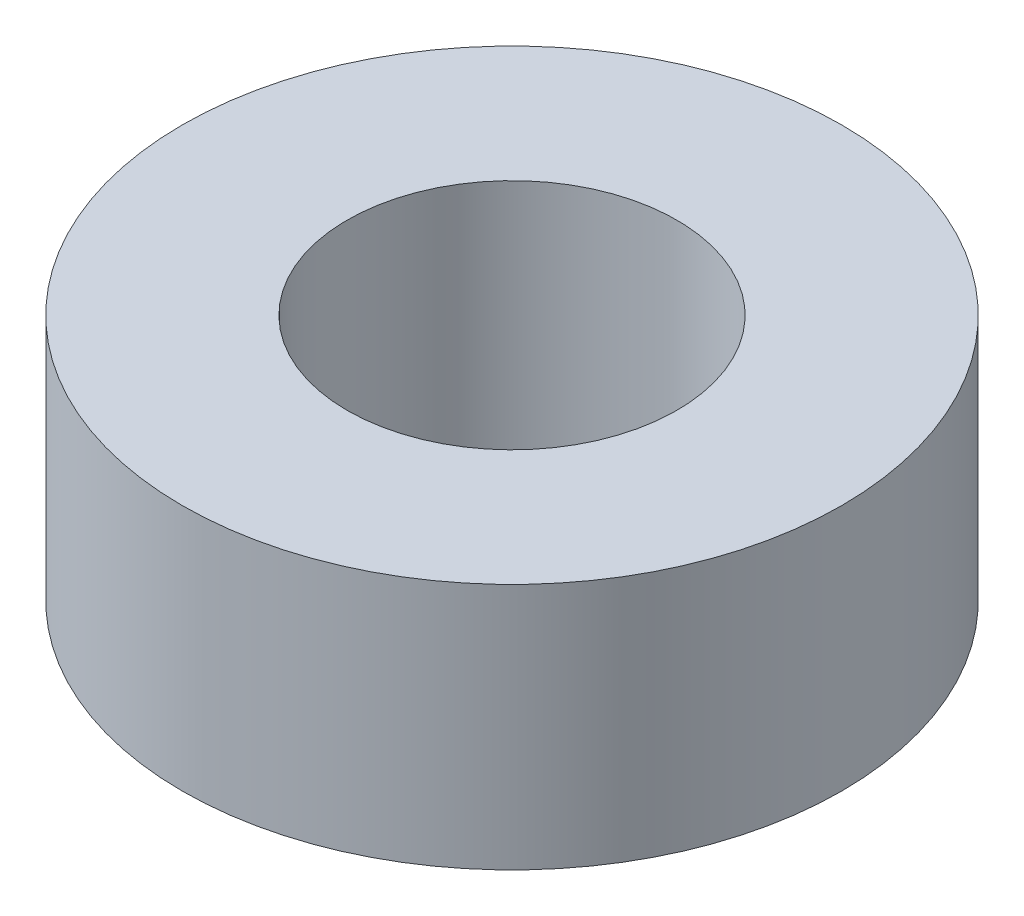
ISO-10303-21;
HEADER;
FILE_DESCRIPTION(('STEP AP214'),'2;1');
FILE_NAME('part.step','',(''),(''),'','','');
FILE_SCHEMA(('AUTOMOTIVE_DESIGN { 1 0 10303 214 1 1 1 1 }'));
ENDSEC;
DATA;
#1=APPLICATION_CONTEXT('core data for automotive mechanical design processes');
#2=APPLICATION_PROTOCOL_DEFINITION('international standard','automotive_design',2000,#1);
#3=PRODUCT_CONTEXT('',#1,'mechanical');
#4=PRODUCT('Part','Part','',(#3));
#5=PRODUCT_RELATED_PRODUCT_CATEGORY('part','',(#4));
#6=PRODUCT_DEFINITION_FORMATION('','',#4);
#7=PRODUCT_DEFINITION_CONTEXT('part definition',#1,'design');
#8=PRODUCT_DEFINITION('design','',#6,#7);
#9=PRODUCT_DEFINITION_SHAPE('','',#8);
#10=(LENGTH_UNIT() NAMED_UNIT(*) SI_UNIT(.MILLI.,.METRE.));
#11=(NAMED_UNIT(*) PLANE_ANGLE_UNIT() SI_UNIT($,.RADIAN.));
#12=(NAMED_UNIT(*) SI_UNIT($,.STERADIAN.) SOLID_ANGLE_UNIT());
#13=UNCERTAINTY_MEASURE_WITH_UNIT(LENGTH_MEASURE(1.E-05),#10,'distance_accuracy_value','');
#14=(GEOMETRIC_REPRESENTATION_CONTEXT(3) GLOBAL_UNCERTAINTY_ASSIGNED_CONTEXT((#13)) GLOBAL_UNIT_ASSIGNED_CONTEXT((#10,
#11,#12)) REPRESENTATION_CONTEXT('',''));
#15=CARTESIAN_POINT('',(0.,0.,0.));
#16=DIRECTION('',(0.,0.,1.));
#17=DIRECTION('',(1.,0.,0.));
#18=AXIS2_PLACEMENT_3D('',#15,#16,#17);
#19=CARTESIAN_POINT('',(0.,15.,0.));
#20=DIRECTION('',(0.,1.,0.));
#21=DIRECTION('',(0.,0.,1.));
#22=AXIS2_PLACEMENT_3D('',#19,#20,#21);
#23=PLANE('',#22);
#24=CARTESIAN_POINT('',(0.,15.,0.));
#25=DIRECTION('',(0.,1.,0.));
#26=DIRECTION('',(0.,0.,1.));
#27=AXIS2_PLACEMENT_3D('',#24,#25,#26);
#28=CIRCLE('',#27,20.);
#29=CARTESIAN_POINT('',(0.,15.,20.));
#30=VERTEX_POINT('',#29);
#31=EDGE_CURVE('E10',#30,#30,#28,.T.);
#32=ORIENTED_EDGE('',*,*,#31,.T.);
#33=EDGE_LOOP('',(#32));
#34=FACE_BOUND('',#33,.T.);
#35=CARTESIAN_POINT('',(0.,15.,0.));
#36=DIRECTION('',(0.,1.,0.));
#37=DIRECTION('',(0.,0.,1.));
#38=AXIS2_PLACEMENT_3D('',#35,#36,#37);
#39=CIRCLE('',#38,10.);
#40=CARTESIAN_POINT('',(0.,15.,10.));
#41=VERTEX_POINT('',#40);
#42=EDGE_CURVE('E44',#41,#41,#39,.T.);
#43=ORIENTED_EDGE('',*,*,#42,.F.);
#44=EDGE_LOOP('',(#43));
#45=FACE_BOUND('',#44,.T.);
#46=ADVANCED_FACE('F33',(#34,#45),#23,.T.);
#47=CARTESIAN_POINT('',(0.,0.,0.));
#48=DIRECTION('',(0.,1.,0.));
#49=DIRECTION('',(0.,0.,1.));
#50=AXIS2_PLACEMENT_3D('',#47,#48,#49);
#51=PLANE('',#50);
#52=CARTESIAN_POINT('',(0.,0.,0.));
#53=DIRECTION('',(0.,1.,0.));
#54=DIRECTION('',(0.,0.,1.));
#55=AXIS2_PLACEMENT_3D('',#52,#53,#54);
#56=CIRCLE('',#55,20.);
#57=CARTESIAN_POINT('',(0.,0.,20.));
#58=VERTEX_POINT('',#57);
#59=EDGE_CURVE('E37',#58,#58,#56,.T.);
#60=ORIENTED_EDGE('',*,*,#59,.F.);
#61=EDGE_LOOP('',(#60));
#62=FACE_BOUND('',#61,.T.);
#63=CARTESIAN_POINT('',(0.,0.,0.));
#64=DIRECTION('',(0.,1.,0.));
#65=DIRECTION('',(0.,0.,1.));
#66=AXIS2_PLACEMENT_3D('',#63,#64,#65);
#67=CIRCLE('',#66,10.);
#68=CARTESIAN_POINT('',(0.,0.,10.));
#69=VERTEX_POINT('',#68);
#70=EDGE_CURVE('E46',#69,#69,#67,.T.);
#71=ORIENTED_EDGE('',*,*,#70,.T.);
#72=EDGE_LOOP('',(#71));
#73=FACE_BOUND('',#72,.T.);
#74=ADVANCED_FACE('F56',(#62,#73),#51,.F.);
#75=CARTESIAN_POINT('',(0.,15.,0.));
#76=DIRECTION('',(0.,-1.,0.));
#77=DIRECTION('',(0.,0.,-1.));
#78=AXIS2_PLACEMENT_3D('',#75,#76,#77);
#79=CYLINDRICAL_SURFACE('',#78,20.);
#80=ORIENTED_EDGE('',*,*,#31,.F.);
#81=EDGE_LOOP('',(#80));
#82=FACE_BOUND('',#81,.T.);
#83=ORIENTED_EDGE('',*,*,#59,.T.);
#84=EDGE_LOOP('',(#83));
#85=FACE_BOUND('',#84,.T.);
#86=ADVANCED_FACE('F35',(#82,#85),#79,.T.);
#87=CARTESIAN_POINT('',(0.,15.,0.));
#88=DIRECTION('',(0.,-1.,0.));
#89=DIRECTION('',(0.,0.,-1.));
#90=AXIS2_PLACEMENT_3D('',#87,#88,#89);
#91=CYLINDRICAL_SURFACE('',#90,10.);
#92=ORIENTED_EDGE('',*,*,#42,.T.);
#93=EDGE_LOOP('',(#92));
#94=FACE_BOUND('',#93,.T.);
#95=ORIENTED_EDGE('',*,*,#70,.F.);
#96=EDGE_LOOP('',(#95));
#97=FACE_BOUND('',#96,.T.);
#98=ADVANCED_FACE('F52',(#94,#97),#91,.F.);
#99=CLOSED_SHELL('',(#46,#74,#86,#98));
#100=MANIFOLD_SOLID_BREP('B2',#99);
#101=ADVANCED_BREP_SHAPE_REPRESENTATION('',(#18,#100),#14);
#102=SHAPE_DEFINITION_REPRESENTATION(#9,#101);
ENDSEC;
END-ISO-10303-21;
